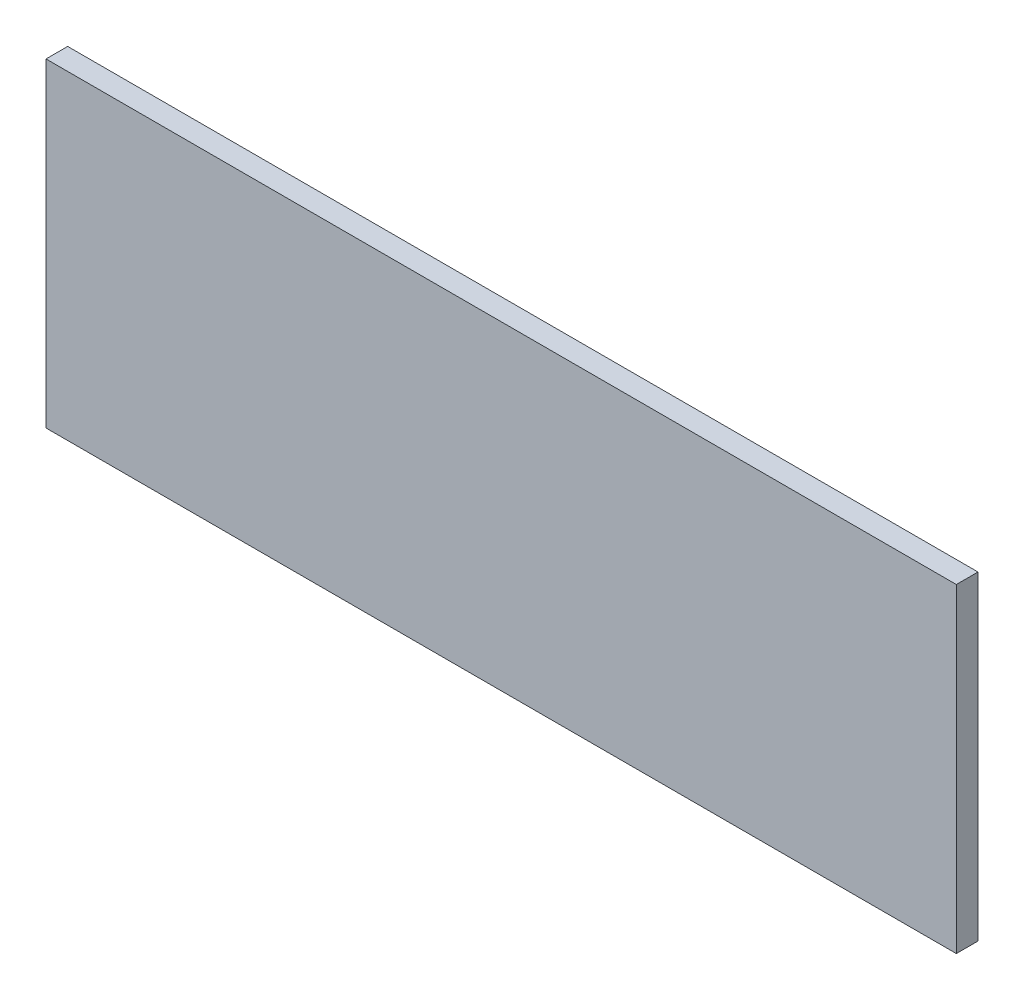
ISO-10303-21;
HEADER;
FILE_DESCRIPTION(('STEP AP214'),'2;1');
FILE_NAME('part.step','',(''),(''),'','','');
FILE_SCHEMA(('AUTOMOTIVE_DESIGN { 1 0 10303 214 1 1 1 1 }'));
ENDSEC;
DATA;
#1=APPLICATION_CONTEXT('core data for automotive mechanical design processes');
#2=APPLICATION_PROTOCOL_DEFINITION('international standard','automotive_design',2000,#1);
#3=PRODUCT_CONTEXT('',#1,'mechanical');
#4=PRODUCT('Part','Part','',(#3));
#5=PRODUCT_RELATED_PRODUCT_CATEGORY('part','',(#4));
#6=PRODUCT_DEFINITION_FORMATION('','',#4);
#7=PRODUCT_DEFINITION_CONTEXT('part definition',#1,'design');
#8=PRODUCT_DEFINITION('design','',#6,#7);
#9=PRODUCT_DEFINITION_SHAPE('','',#8);
#10=(LENGTH_UNIT() NAMED_UNIT(*) SI_UNIT(.MILLI.,.METRE.));
#11=(NAMED_UNIT(*) PLANE_ANGLE_UNIT() SI_UNIT($,.RADIAN.));
#12=(NAMED_UNIT(*) SI_UNIT($,.STERADIAN.) SOLID_ANGLE_UNIT());
#13=UNCERTAINTY_MEASURE_WITH_UNIT(LENGTH_MEASURE(1.E-05),#10,'distance_accuracy_value','');
#14=(GEOMETRIC_REPRESENTATION_CONTEXT(3) GLOBAL_UNCERTAINTY_ASSIGNED_CONTEXT((#13)) GLOBAL_UNIT_ASSIGNED_CONTEXT((#10,
#11,#12)) REPRESENTATION_CONTEXT('',''));
#15=CARTESIAN_POINT('',(0.,0.,0.));
#16=DIRECTION('',(0.,0.,1.));
#17=DIRECTION('',(1.,0.,0.));
#18=AXIS2_PLACEMENT_3D('',#15,#16,#17);
#19=CARTESIAN_POINT('',(-41.9751180678327,22.4157140589614,1.5875));
#20=DIRECTION('',(1.,0.,0.));
#21=DIRECTION('',(0.,1.,0.));
#22=AXIS2_PLACEMENT_3D('',#19,#20,#21);
#23=PLANE('',#22);
#24=DIRECTION('',(0.,-1.,0.));
#25=VECTOR('',#24,1.);
#26=CARTESIAN_POINT('',(-41.9751180678327,22.4157140589614,0.));
#27=LINE('',#26,#25);
#28=CARTESIAN_POINT('',(-41.9751180678327,22.4157140589614,0.));
#29=VERTEX_POINT('',#28);
#30=CARTESIAN_POINT('',(-41.9751180678327,-0.99546594103862,0.));
#31=VERTEX_POINT('',#30);
#32=EDGE_CURVE('E98',#29,#31,#27,.T.);
#33=ORIENTED_EDGE('',*,*,#32,.T.);
#34=DIRECTION('',(0.,0.,-1.));
#35=VECTOR('',#34,1.);
#36=CARTESIAN_POINT('',(-41.9751180678327,-0.99546594103862,1.5875));
#37=LINE('',#36,#35);
#38=CARTESIAN_POINT('',(-41.9751180678327,-0.99546594103862,1.5875));
#39=VERTEX_POINT('',#38);
#40=EDGE_CURVE('E11',#39,#31,#37,.T.);
#41=ORIENTED_EDGE('',*,*,#40,.F.);
#42=DIRECTION('',(0.,-1.,0.));
#43=VECTOR('',#42,1.);
#44=CARTESIAN_POINT('',(-41.9751180678327,22.4157140589614,1.5875));
#45=LINE('',#44,#43);
#46=CARTESIAN_POINT('',(-41.9751180678327,22.4157140589614,1.5875));
#47=VERTEX_POINT('',#46);
#48=EDGE_CURVE('E86',#47,#39,#45,.T.);
#49=ORIENTED_EDGE('',*,*,#48,.F.);
#50=DIRECTION('',(0.,0.,-1.));
#51=VECTOR('',#50,1.);
#52=CARTESIAN_POINT('',(-41.9751180678327,22.4157140589614,1.5875));
#53=LINE('',#52,#51);
#54=EDGE_CURVE('E94',#47,#29,#53,.T.);
#55=ORIENTED_EDGE('',*,*,#54,.T.);
#56=EDGE_LOOP('',(#33,#41,#49,#55));
#57=FACE_BOUND('',#56,.T.);
#58=ADVANCED_FACE('F35',(#57),#23,.F.);
#59=CARTESIAN_POINT('',(-41.9751180678327,-0.99546594103862,1.5875));
#60=DIRECTION('',(0.,1.,0.));
#61=DIRECTION('',(0.,0.,1.));
#62=AXIS2_PLACEMENT_3D('',#59,#60,#61);
#63=PLANE('',#62);
#64=DIRECTION('',(1.,0.,0.));
#65=VECTOR('',#64,1.);
#66=CARTESIAN_POINT('',(-41.9751180678327,-0.99546594103862,0.));
#67=LINE('',#66,#65);
#68=CARTESIAN_POINT('',(24.6998819321673,-0.99546594103862,0.));
#69=VERTEX_POINT('',#68);
#70=EDGE_CURVE('E90',#31,#69,#67,.T.);
#71=ORIENTED_EDGE('',*,*,#70,.T.);
#72=DIRECTION('',(0.,0.,-1.));
#73=VECTOR('',#72,1.);
#74=CARTESIAN_POINT('',(24.6998819321673,-0.99546594103862,1.5875));
#75=LINE('',#74,#73);
#76=CARTESIAN_POINT('',(24.6998819321673,-0.99546594103862,1.5875));
#77=VERTEX_POINT('',#76);
#78=EDGE_CURVE('E43',#77,#69,#75,.T.);
#79=ORIENTED_EDGE('',*,*,#78,.F.);
#80=DIRECTION('',(1.,0.,0.));
#81=VECTOR('',#80,1.);
#82=CARTESIAN_POINT('',(-41.9751180678327,-0.99546594103862,1.5875));
#83=LINE('',#82,#81);
#84=EDGE_CURVE('E81',#39,#77,#83,.T.);
#85=ORIENTED_EDGE('',*,*,#84,.F.);
#86=ORIENTED_EDGE('',*,*,#40,.T.);
#87=EDGE_LOOP('',(#71,#79,#85,#86));
#88=FACE_BOUND('',#87,.T.);
#89=ADVANCED_FACE('F89',(#88),#63,.F.);
#90=CARTESIAN_POINT('',(24.6998819321673,22.4157140589614,1.5875));
#91=DIRECTION('',(-1.,0.,0.));
#92=DIRECTION('',(0.,0.,1.));
#93=AXIS2_PLACEMENT_3D('',#90,#91,#92);
#94=PLANE('',#93);
#95=DIRECTION('',(0.,1.,0.));
#96=VECTOR('',#95,1.);
#97=CARTESIAN_POINT('',(24.6998819321673,22.4157140589614,0.));
#98=LINE('',#97,#96);
#99=CARTESIAN_POINT('',(24.6998819321673,22.4157140589614,0.));
#100=VERTEX_POINT('',#99);
#101=EDGE_CURVE('E68',#69,#100,#98,.T.);
#102=ORIENTED_EDGE('',*,*,#101,.T.);
#103=DIRECTION('',(0.,0.,-1.));
#104=VECTOR('',#103,1.);
#105=CARTESIAN_POINT('',(24.6998819321673,22.4157140589614,1.5875));
#106=LINE('',#105,#104);
#107=CARTESIAN_POINT('',(24.6998819321673,22.4157140589614,1.5875));
#108=VERTEX_POINT('',#107);
#109=EDGE_CURVE('E91',#108,#100,#106,.T.);
#110=ORIENTED_EDGE('',*,*,#109,.F.);
#111=DIRECTION('',(0.,1.,0.));
#112=VECTOR('',#111,1.);
#113=CARTESIAN_POINT('',(24.6998819321673,22.4157140589614,1.5875));
#114=LINE('',#113,#112);
#115=EDGE_CURVE('E84',#77,#108,#114,.T.);
#116=ORIENTED_EDGE('',*,*,#115,.F.);
#117=ORIENTED_EDGE('',*,*,#78,.T.);
#118=EDGE_LOOP('',(#102,#110,#116,#117));
#119=FACE_BOUND('',#118,.T.);
#120=ADVANCED_FACE('F92',(#119),#94,.F.);
#121=CARTESIAN_POINT('',(-41.9751180678327,22.4157140589614,1.5875));
#122=DIRECTION('',(0.,-1.,0.));
#123=DIRECTION('',(0.,0.,-1.));
#124=AXIS2_PLACEMENT_3D('',#121,#122,#123);
#125=PLANE('',#124);
#126=DIRECTION('',(-1.,0.,0.));
#127=VECTOR('',#126,1.);
#128=CARTESIAN_POINT('',(-41.9751180678327,22.4157140589614,0.));
#129=LINE('',#128,#127);
#130=EDGE_CURVE('E74',#100,#29,#129,.T.);
#131=ORIENTED_EDGE('',*,*,#130,.T.);
#132=ORIENTED_EDGE('',*,*,#54,.F.);
#133=DIRECTION('',(-1.,0.,0.));
#134=VECTOR('',#133,1.);
#135=CARTESIAN_POINT('',(-41.9751180678327,22.4157140589614,1.5875));
#136=LINE('',#135,#134);
#137=EDGE_CURVE('E51',#108,#47,#136,.T.);
#138=ORIENTED_EDGE('',*,*,#137,.F.);
#139=ORIENTED_EDGE('',*,*,#109,.T.);
#140=EDGE_LOOP('',(#131,#132,#138,#139));
#141=FACE_BOUND('',#140,.T.);
#142=ADVANCED_FACE('F105',(#141),#125,.F.);
#143=CARTESIAN_POINT('',(0.,0.,1.5875));
#144=DIRECTION('',(0.,0.,1.));
#145=DIRECTION('',(1.,0.,0.));
#146=AXIS2_PLACEMENT_3D('',#143,#144,#145);
#147=PLANE('',#146);
#148=ORIENTED_EDGE('',*,*,#48,.T.);
#149=ORIENTED_EDGE('',*,*,#84,.T.);
#150=ORIENTED_EDGE('',*,*,#115,.T.);
#151=ORIENTED_EDGE('',*,*,#137,.T.);
#152=EDGE_LOOP('',(#148,#149,#150,#151));
#153=FACE_BOUND('',#152,.T.);
#154=ADVANCED_FACE('F82',(#153),#147,.T.);
#155=CARTESIAN_POINT('',(0.,0.,0.));
#156=DIRECTION('',(0.,0.,1.));
#157=DIRECTION('',(1.,0.,0.));
#158=AXIS2_PLACEMENT_3D('',#155,#156,#157);
#159=PLANE('',#158);
#160=ORIENTED_EDGE('',*,*,#32,.F.);
#161=ORIENTED_EDGE('',*,*,#130,.F.);
#162=ORIENTED_EDGE('',*,*,#101,.F.);
#163=ORIENTED_EDGE('',*,*,#70,.F.);
#164=EDGE_LOOP('',(#160,#161,#162,#163));
#165=FACE_BOUND('',#164,.T.);
#166=ADVANCED_FACE('F108',(#165),#159,.F.);
#167=CLOSED_SHELL('',(#58,#89,#120,#142,#154,#166));
#168=MANIFOLD_SOLID_BREP('B2',#167);
#169=ADVANCED_BREP_SHAPE_REPRESENTATION('',(#18,#168),#14);
#170=SHAPE_DEFINITION_REPRESENTATION(#9,#169);
ENDSEC;
END-ISO-10303-21;
